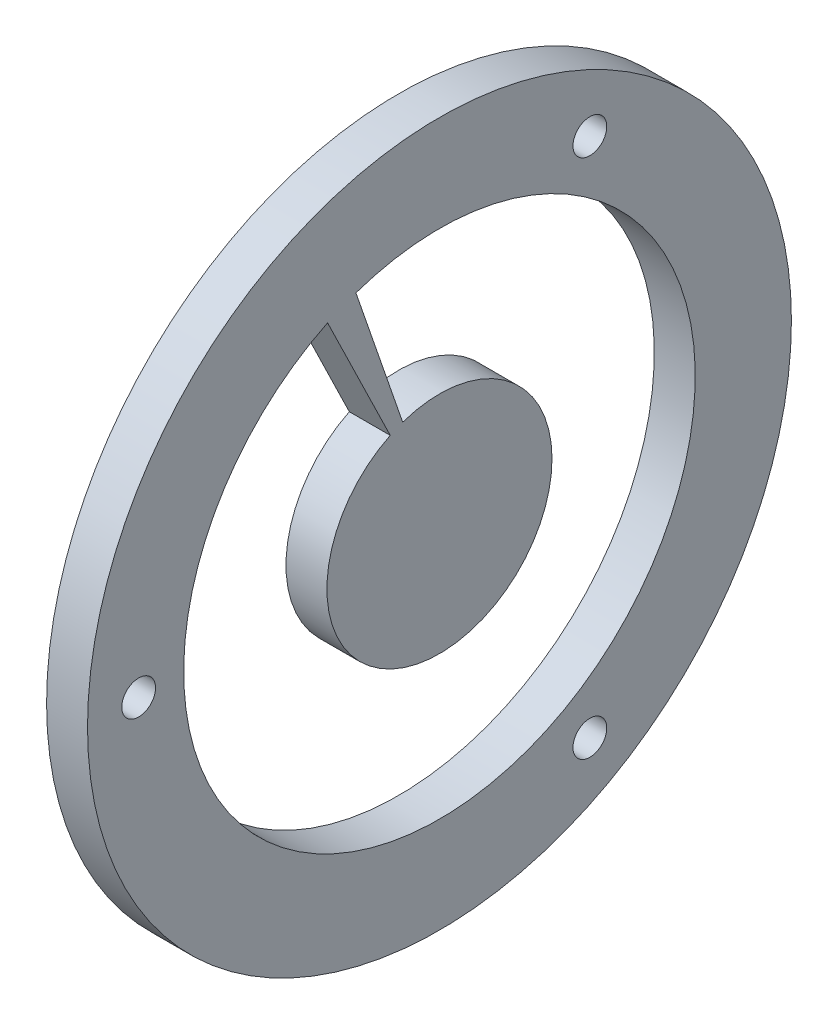
ISO-10303-21;
HEADER;
FILE_DESCRIPTION(('STEP AP214'),'2;1');
FILE_NAME('part.step','',(''),(''),'','','');
FILE_SCHEMA(('AUTOMOTIVE_DESIGN { 1 0 10303 214 1 1 1 1 }'));
ENDSEC;
DATA;
#1=APPLICATION_CONTEXT('core data for automotive mechanical design processes');
#2=APPLICATION_PROTOCOL_DEFINITION('international standard','automotive_design',2000,#1);
#3=PRODUCT_CONTEXT('',#1,'mechanical');
#4=PRODUCT('Part','Part','',(#3));
#5=PRODUCT_RELATED_PRODUCT_CATEGORY('part','',(#4));
#6=PRODUCT_DEFINITION_FORMATION('','',#4);
#7=PRODUCT_DEFINITION_CONTEXT('part definition',#1,'design');
#8=PRODUCT_DEFINITION('design','',#6,#7);
#9=PRODUCT_DEFINITION_SHAPE('','',#8);
#10=(LENGTH_UNIT() NAMED_UNIT(*) SI_UNIT(.MILLI.,.METRE.));
#11=(NAMED_UNIT(*) PLANE_ANGLE_UNIT() SI_UNIT($,.RADIAN.));
#12=(NAMED_UNIT(*) SI_UNIT($,.STERADIAN.) SOLID_ANGLE_UNIT());
#13=UNCERTAINTY_MEASURE_WITH_UNIT(LENGTH_MEASURE(1.E-05),#10,'distance_accuracy_value','');
#14=(GEOMETRIC_REPRESENTATION_CONTEXT(3) GLOBAL_UNCERTAINTY_ASSIGNED_CONTEXT((#13)) GLOBAL_UNIT_ASSIGNED_CONTEXT((#10,
#11,#12)) REPRESENTATION_CONTEXT('',''));
#15=CARTESIAN_POINT('',(0.,0.,0.));
#16=DIRECTION('',(0.,0.,1.));
#17=DIRECTION('',(1.,0.,0.));
#18=AXIS2_PLACEMENT_3D('',#15,#16,#17);
#19=CARTESIAN_POINT('',(159.7,34.4,0.));
#20=DIRECTION('',(1.,0.,0.));
#21=DIRECTION('',(0.,0.,-1.));
#22=AXIS2_PLACEMENT_3D('',#19,#20,#21);
#23=PLANE('',#22);
#24=CARTESIAN_POINT('',(159.7,0.,0.));
#25=DIRECTION('',(-1.,0.,0.));
#26=DIRECTION('',(0.,0.,1.));
#27=AXIS2_PLACEMENT_3D('',#24,#25,#26);
#28=CIRCLE('',#27,34.4);
#29=CARTESIAN_POINT('',(159.7,0.,34.4));
#30=VERTEX_POINT('',#29);
#31=EDGE_CURVE('E40',#30,#30,#28,.T.);
#32=ORIENTED_EDGE('',*,*,#31,.T.);
#33=EDGE_LOOP('',(#32));
#34=FACE_BOUND('',#33,.T.);
#35=CARTESIAN_POINT('',(159.7,25.4611468712625,-14.7));
#36=DIRECTION('',(1.,0.,0.));
#37=DIRECTION('',(0.,0.,-1.));
#38=AXIS2_PLACEMENT_3D('',#35,#36,#37);
#39=CIRCLE('',#38,1.65);
#40=CARTESIAN_POINT('',(159.7,25.4611468712625,-16.35));
#41=VERTEX_POINT('',#40);
#42=EDGE_CURVE('E113',#41,#41,#39,.F.);
#43=ORIENTED_EDGE('',*,*,#42,.F.);
#44=EDGE_LOOP('',(#43));
#45=FACE_BOUND('',#44,.T.);
#46=CARTESIAN_POINT('',(159.7,-25.4611468712625,-14.7));
#47=DIRECTION('',(1.,0.,0.));
#48=DIRECTION('',(0.,0.,-1.));
#49=AXIS2_PLACEMENT_3D('',#46,#47,#48);
#50=CIRCLE('',#49,1.65);
#51=CARTESIAN_POINT('',(159.7,-25.4611468712625,-16.35));
#52=VERTEX_POINT('',#51);
#53=EDGE_CURVE('E121',#52,#52,#50,.F.);
#54=ORIENTED_EDGE('',*,*,#53,.F.);
#55=EDGE_LOOP('',(#54));
#56=FACE_BOUND('',#55,.T.);
#57=CARTESIAN_POINT('',(159.7,0.,29.4));
#58=DIRECTION('',(1.,0.,0.));
#59=DIRECTION('',(0.,0.,-1.));
#60=AXIS2_PLACEMENT_3D('',#57,#58,#59);
#61=CIRCLE('',#60,1.65);
#62=CARTESIAN_POINT('',(159.7,0.,27.75));
#63=VERTEX_POINT('',#62);
#64=EDGE_CURVE('E124',#63,#63,#61,.F.);
#65=ORIENTED_EDGE('',*,*,#64,.F.);
#66=EDGE_LOOP('',(#65));
#67=FACE_BOUND('',#66,.T.);
#68=CARTESIAN_POINT('',(159.7,0.,0.));
#69=DIRECTION('',(1.,0.,0.));
#70=DIRECTION('',(0.,0.,-1.));
#71=AXIS2_PLACEMENT_3D('',#68,#69,#70);
#72=CIRCLE('',#71,25.);
#73=CARTESIAN_POINT('',(159.7,23.6291070001442,8.16488226343393));
#74=VERTEX_POINT('',#73);
#75=CARTESIAN_POINT('',(159.7,22.4817454092484,10.9348581771206));
#76=VERTEX_POINT('',#75);
#77=EDGE_CURVE('E107',#74,#76,#72,.F.);
#78=ORIENTED_EDGE('',*,*,#77,.F.);
#79=DIRECTION('',(0.,0.945164280005767,0.326595290537357));
#80=VECTOR('',#79,1.);
#81=CARTESIAN_POINT('',(159.7,30.7307417572394,10.6188053706101));
#82=LINE('',#81,#80);
#83=CARTESIAN_POINT('',(159.7,10.3968070800634,3.59254819591092));
#84=VERTEX_POINT('',#83);
#85=EDGE_CURVE('E81',#84,#74,#82,.T.);
#86=ORIENTED_EDGE('',*,*,#85,.F.);
#87=CARTESIAN_POINT('',(159.7,0.,0.));
#88=DIRECTION('',(1.,0.,0.));
#89=DIRECTION('',(0.,0.,-1.));
#90=AXIS2_PLACEMENT_3D('',#87,#88,#89);
#91=CIRCLE('',#90,11.);
#92=CARTESIAN_POINT('',(159.7,9.89196798006927,4.81133759793305));
#93=VERTEX_POINT('',#92);
#94=EDGE_CURVE('E104',#93,#84,#91,.T.);
#95=ORIENTED_EDGE('',*,*,#94,.F.);
#96=DIRECTION('',(0.,-0.899269816369934,-0.437394327084823));
#97=VECTOR('',#96,1.);
#98=CARTESIAN_POINT('',(159.7,27.8188053706101,13.5307417572394));
#99=LINE('',#98,#97);
#100=EDGE_CURVE('E84',#76,#93,#99,.T.);
#101=ORIENTED_EDGE('',*,*,#100,.F.);
#102=EDGE_LOOP('',(#78,#86,#95,#101));
#103=FACE_BOUND('',#102,.T.);
#104=ADVANCED_FACE('F33',(#34,#45,#56,#67,#103),#23,.F.);
#105=CARTESIAN_POINT('',(163.7,0.,0.));
#106=DIRECTION('',(-1.,0.,0.));
#107=DIRECTION('',(0.,0.,1.));
#108=AXIS2_PLACEMENT_3D('',#105,#106,#107);
#109=PLANE('',#108);
#110=CARTESIAN_POINT('',(163.7,0.,0.));
#111=DIRECTION('',(-1.,0.,0.));
#112=DIRECTION('',(0.,0.,1.));
#113=AXIS2_PLACEMENT_3D('',#110,#111,#112);
#114=CIRCLE('',#113,34.4);
#115=CARTESIAN_POINT('',(163.7,0.,34.4));
#116=VERTEX_POINT('',#115);
#117=EDGE_CURVE('E11',#116,#116,#114,.T.);
#118=ORIENTED_EDGE('',*,*,#117,.F.);
#119=EDGE_LOOP('',(#118));
#120=FACE_BOUND('',#119,.T.);
#121=CARTESIAN_POINT('',(163.7,25.4611468712625,-14.7));
#122=DIRECTION('',(1.,0.,0.));
#123=DIRECTION('',(0.,0.,-1.));
#124=AXIS2_PLACEMENT_3D('',#121,#122,#123);
#125=CIRCLE('',#124,1.65);
#126=CARTESIAN_POINT('',(163.7,25.4611468712625,-16.35));
#127=VERTEX_POINT('',#126);
#128=EDGE_CURVE('E109',#127,#127,#125,.T.);
#129=ORIENTED_EDGE('',*,*,#128,.F.);
#130=EDGE_LOOP('',(#129));
#131=FACE_BOUND('',#130,.T.);
#132=CARTESIAN_POINT('',(163.7,-25.4611468712625,-14.7));
#133=DIRECTION('',(1.,0.,0.));
#134=DIRECTION('',(0.,0.,-1.));
#135=AXIS2_PLACEMENT_3D('',#132,#133,#134);
#136=CIRCLE('',#135,1.65);
#137=CARTESIAN_POINT('',(163.7,-25.4611468712625,-16.35));
#138=VERTEX_POINT('',#137);
#139=EDGE_CURVE('E114',#138,#138,#136,.T.);
#140=ORIENTED_EDGE('',*,*,#139,.F.);
#141=EDGE_LOOP('',(#140));
#142=FACE_BOUND('',#141,.T.);
#143=CARTESIAN_POINT('',(163.7,0.,29.4));
#144=DIRECTION('',(1.,0.,0.));
#145=DIRECTION('',(0.,0.,-1.));
#146=AXIS2_PLACEMENT_3D('',#143,#144,#145);
#147=CIRCLE('',#146,1.65);
#148=CARTESIAN_POINT('',(163.7,0.,27.75));
#149=VERTEX_POINT('',#148);
#150=EDGE_CURVE('E110',#149,#149,#147,.T.);
#151=ORIENTED_EDGE('',*,*,#150,.F.);
#152=EDGE_LOOP('',(#151));
#153=FACE_BOUND('',#152,.T.);
#154=CARTESIAN_POINT('',(163.7,0.,0.));
#155=DIRECTION('',(1.,0.,0.));
#156=DIRECTION('',(0.,0.,-1.));
#157=AXIS2_PLACEMENT_3D('',#154,#155,#156);
#158=CIRCLE('',#157,25.);
#159=CARTESIAN_POINT('',(163.7,22.4817454092484,10.9348581771206));
#160=VERTEX_POINT('',#159);
#161=CARTESIAN_POINT('',(163.7,23.6291070001442,8.16488226343393));
#162=VERTEX_POINT('',#161);
#163=EDGE_CURVE('E88',#160,#162,#158,.T.);
#164=ORIENTED_EDGE('',*,*,#163,.F.);
#165=DIRECTION('',(0.,0.899269816369934,0.437394327084823));
#166=VECTOR('',#165,1.);
#167=CARTESIAN_POINT('',(163.7,22.4817454092484,10.9348581771206));
#168=LINE('',#167,#166);
#169=CARTESIAN_POINT('',(163.7,9.89196798006927,4.81133759793305));
#170=VERTEX_POINT('',#169);
#171=EDGE_CURVE('E95',#170,#160,#168,.T.);
#172=ORIENTED_EDGE('',*,*,#171,.F.);
#173=CARTESIAN_POINT('',(163.7,0.,0.));
#174=DIRECTION('',(-1.,0.,0.));
#175=DIRECTION('',(0.,0.,-1.));
#176=AXIS2_PLACEMENT_3D('',#173,#174,#175);
#177=CIRCLE('',#176,11.);
#178=CARTESIAN_POINT('',(163.7,10.3968070800634,3.59254819591092));
#179=VERTEX_POINT('',#178);
#180=EDGE_CURVE('E55',#179,#170,#177,.T.);
#181=ORIENTED_EDGE('',*,*,#180,.F.);
#182=DIRECTION('',(0.,-0.945164280005766,-0.326595290537357));
#183=VECTOR('',#182,1.);
#184=CARTESIAN_POINT('',(163.7,23.6291070001442,8.16488226343393));
#185=LINE('',#184,#183);
#186=EDGE_CURVE('E79',#162,#179,#185,.T.);
#187=ORIENTED_EDGE('',*,*,#186,.F.);
#188=EDGE_LOOP('',(#164,#172,#181,#187));
#189=FACE_BOUND('',#188,.T.);
#190=ADVANCED_FACE('F93',(#120,#131,#142,#153,#189),#109,.F.);
#191=CARTESIAN_POINT('',(-110.,0.,0.));
#192=DIRECTION('',(-1.,0.,0.));
#193=DIRECTION('',(0.,0.,1.));
#194=AXIS2_PLACEMENT_3D('',#191,#192,#193);
#195=CYLINDRICAL_SURFACE('',#194,34.4);
#196=ORIENTED_EDGE('',*,*,#31,.F.);
#197=EDGE_LOOP('',(#196));
#198=FACE_BOUND('',#197,.T.);
#199=ORIENTED_EDGE('',*,*,#117,.T.);
#200=EDGE_LOOP('',(#199));
#201=FACE_BOUND('',#200,.T.);
#202=ADVANCED_FACE('F131',(#198,#201),#195,.T.);
#203=CARTESIAN_POINT('',(159.7,25.4611468712625,-14.7));
#204=DIRECTION('',(-1.,0.,0.));
#205=DIRECTION('',(0.,0.,1.));
#206=AXIS2_PLACEMENT_3D('',#203,#204,#205);
#207=CYLINDRICAL_SURFACE('',#206,1.65);
#208=ORIENTED_EDGE('',*,*,#128,.T.);
#209=EDGE_LOOP('',(#208));
#210=FACE_BOUND('',#209,.T.);
#211=ORIENTED_EDGE('',*,*,#42,.T.);
#212=EDGE_LOOP('',(#211));
#213=FACE_BOUND('',#212,.T.);
#214=ADVANCED_FACE('F134',(#210,#213),#207,.F.);
#215=CARTESIAN_POINT('',(159.7,-25.4611468712625,-14.7));
#216=DIRECTION('',(-1.,0.,0.));
#217=DIRECTION('',(0.,0.,1.));
#218=AXIS2_PLACEMENT_3D('',#215,#216,#217);
#219=CYLINDRICAL_SURFACE('',#218,1.65);
#220=ORIENTED_EDGE('',*,*,#139,.T.);
#221=EDGE_LOOP('',(#220));
#222=FACE_BOUND('',#221,.T.);
#223=ORIENTED_EDGE('',*,*,#53,.T.);
#224=EDGE_LOOP('',(#223));
#225=FACE_BOUND('',#224,.T.);
#226=ADVANCED_FACE('F149',(#222,#225),#219,.F.);
#227=CARTESIAN_POINT('',(159.7,0.,29.4));
#228=DIRECTION('',(-1.,0.,0.));
#229=DIRECTION('',(0.,0.,1.));
#230=AXIS2_PLACEMENT_3D('',#227,#228,#229);
#231=CYLINDRICAL_SURFACE('',#230,1.65);
#232=ORIENTED_EDGE('',*,*,#150,.T.);
#233=EDGE_LOOP('',(#232));
#234=FACE_BOUND('',#233,.T.);
#235=ORIENTED_EDGE('',*,*,#64,.T.);
#236=EDGE_LOOP('',(#235));
#237=FACE_BOUND('',#236,.T.);
#238=ADVANCED_FACE('F146',(#234,#237),#231,.F.);
#239=CARTESIAN_POINT('',(159.7,0.,0.));
#240=DIRECTION('',(-1.,0.,0.));
#241=DIRECTION('',(0.,0.,1.));
#242=AXIS2_PLACEMENT_3D('',#239,#240,#241);
#243=CYLINDRICAL_SURFACE('',#242,25.);
#244=ORIENTED_EDGE('',*,*,#77,.T.);
#245=DIRECTION('',(-1.,0.,0.));
#246=VECTOR('',#245,1.);
#247=CARTESIAN_POINT('',(159.7,22.4817454092484,10.9348581771206));
#248=LINE('',#247,#246);
#249=EDGE_CURVE('E47',#160,#76,#248,.T.);
#250=ORIENTED_EDGE('',*,*,#249,.F.);
#251=ORIENTED_EDGE('',*,*,#163,.T.);
#252=DIRECTION('',(-1.,0.,0.));
#253=VECTOR('',#252,1.);
#254=CARTESIAN_POINT('',(159.7,23.6291070001442,8.16488226343393));
#255=LINE('',#254,#253);
#256=EDGE_CURVE('E74',#162,#74,#255,.T.);
#257=ORIENTED_EDGE('',*,*,#256,.T.);
#258=EDGE_LOOP('',(#244,#250,#251,#257));
#259=FACE_BOUND('',#258,.T.);
#260=ADVANCED_FACE('F89',(#259),#243,.F.);
#261=CARTESIAN_POINT('',(159.7,23.6291070001442,8.16488226343393));
#262=DIRECTION('',(0.,0.326595290537357,-0.945164280005766));
#263=DIRECTION('',(0.,0.945164280005767,0.326595290537357));
#264=AXIS2_PLACEMENT_3D('',#261,#262,#263);
#265=PLANE('',#264);
#266=ORIENTED_EDGE('',*,*,#85,.T.);
#267=ORIENTED_EDGE('',*,*,#256,.F.);
#268=ORIENTED_EDGE('',*,*,#186,.T.);
#269=DIRECTION('',(-1.,0.,0.));
#270=VECTOR('',#269,1.);
#271=CARTESIAN_POINT('',(159.7,10.3968070800634,3.59254819591092));
#272=LINE('',#271,#270);
#273=EDGE_CURVE('E85',#179,#84,#272,.T.);
#274=ORIENTED_EDGE('',*,*,#273,.T.);
#275=EDGE_LOOP('',(#266,#267,#268,#274));
#276=FACE_BOUND('',#275,.T.);
#277=ADVANCED_FACE('F76',(#276),#265,.T.);
#278=CARTESIAN_POINT('',(159.7,0.,0.));
#279=DIRECTION('',(-1.,0.,0.));
#280=DIRECTION('',(0.,0.,1.));
#281=AXIS2_PLACEMENT_3D('',#278,#279,#280);
#282=CYLINDRICAL_SURFACE('',#281,11.);
#283=ORIENTED_EDGE('',*,*,#94,.T.);
#284=ORIENTED_EDGE('',*,*,#273,.F.);
#285=ORIENTED_EDGE('',*,*,#180,.T.);
#286=DIRECTION('',(-1.,0.,0.));
#287=VECTOR('',#286,1.);
#288=CARTESIAN_POINT('',(159.7,9.89196798006927,4.81133759793305));
#289=LINE('',#288,#287);
#290=EDGE_CURVE('E100',#170,#93,#289,.T.);
#291=ORIENTED_EDGE('',*,*,#290,.T.);
#292=EDGE_LOOP('',(#283,#284,#285,#291));
#293=FACE_BOUND('',#292,.T.);
#294=ADVANCED_FACE('F158',(#293),#282,.T.);
#295=CARTESIAN_POINT('',(159.7,22.4817454092484,10.9348581771206));
#296=DIRECTION('',(0.,-0.437394327084823,0.899269816369934));
#297=DIRECTION('',(0.,-0.899269816369934,-0.437394327084823));
#298=AXIS2_PLACEMENT_3D('',#295,#296,#297);
#299=PLANE('',#298);
#300=ORIENTED_EDGE('',*,*,#100,.T.);
#301=ORIENTED_EDGE('',*,*,#290,.F.);
#302=ORIENTED_EDGE('',*,*,#171,.T.);
#303=ORIENTED_EDGE('',*,*,#249,.T.);
#304=EDGE_LOOP('',(#300,#301,#302,#303));
#305=FACE_BOUND('',#304,.T.);
#306=ADVANCED_FACE('F157',(#305),#299,.T.);
#307=CLOSED_SHELL('',(#104,#190,#202,#214,#226,#238,#260,#277,#294,#306));
#308=MANIFOLD_SOLID_BREP('B2',#307);
#309=ADVANCED_BREP_SHAPE_REPRESENTATION('',(#18,#308),#14);
#310=SHAPE_DEFINITION_REPRESENTATION(#9,#309);
ENDSEC;
END-ISO-10303-21;
